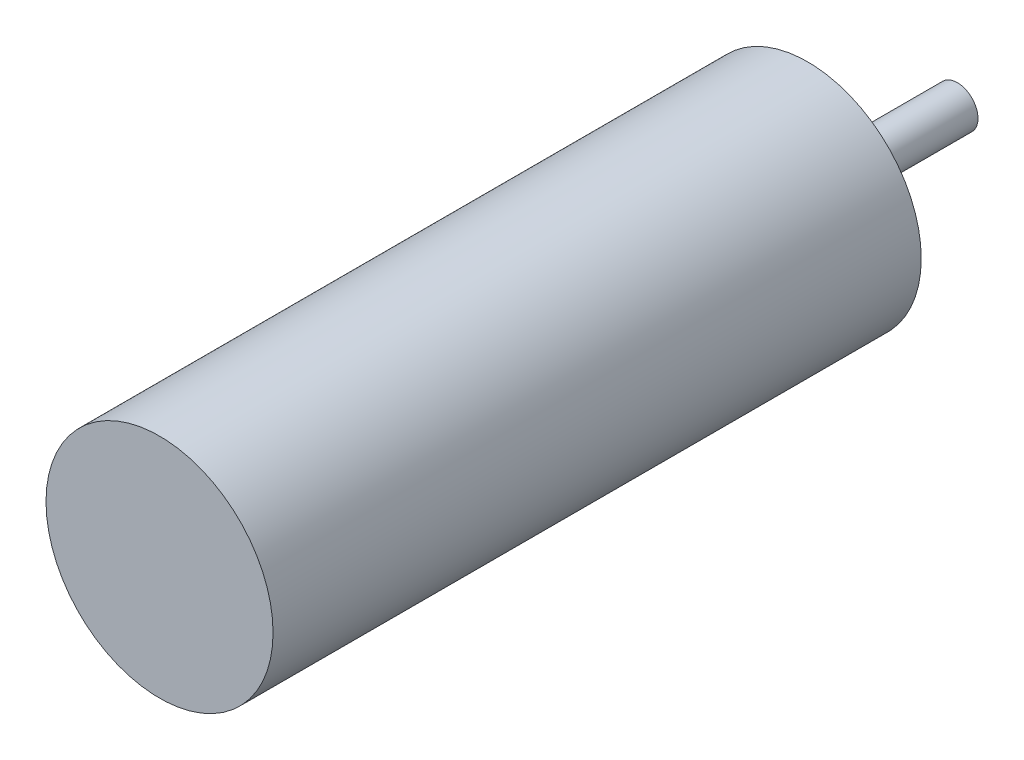
ISO-10303-21;
HEADER;
FILE_DESCRIPTION(('STEP AP214'),'2;1');
FILE_NAME('part.step','',(''),(''),'','','');
FILE_SCHEMA(('AUTOMOTIVE_DESIGN { 1 0 10303 214 1 1 1 1 }'));
ENDSEC;
DATA;
#1=APPLICATION_CONTEXT('core data for automotive mechanical design processes');
#2=APPLICATION_PROTOCOL_DEFINITION('international standard','automotive_design',2000,#1);
#3=PRODUCT_CONTEXT('',#1,'mechanical');
#4=PRODUCT('Part','Part','',(#3));
#5=PRODUCT_RELATED_PRODUCT_CATEGORY('part','',(#4));
#6=PRODUCT_DEFINITION_FORMATION('','',#4);
#7=PRODUCT_DEFINITION_CONTEXT('part definition',#1,'design');
#8=PRODUCT_DEFINITION('design','',#6,#7);
#9=PRODUCT_DEFINITION_SHAPE('','',#8);
#10=(LENGTH_UNIT() NAMED_UNIT(*) SI_UNIT(.MILLI.,.METRE.));
#11=(NAMED_UNIT(*) PLANE_ANGLE_UNIT() SI_UNIT($,.RADIAN.));
#12=(NAMED_UNIT(*) SI_UNIT($,.STERADIAN.) SOLID_ANGLE_UNIT());
#13=UNCERTAINTY_MEASURE_WITH_UNIT(LENGTH_MEASURE(1.E-05),#10,'distance_accuracy_value','');
#14=(GEOMETRIC_REPRESENTATION_CONTEXT(3) GLOBAL_UNCERTAINTY_ASSIGNED_CONTEXT((#13)) GLOBAL_UNIT_ASSIGNED_CONTEXT((#10,
#11,#12)) REPRESENTATION_CONTEXT('',''));
#15=CARTESIAN_POINT('',(0.,0.,0.));
#16=DIRECTION('',(0.,0.,1.));
#17=DIRECTION('',(1.,0.,0.));
#18=AXIS2_PLACEMENT_3D('',#15,#16,#17);
#19=CARTESIAN_POINT('',(0.,0.,0.));
#20=DIRECTION('',(0.,0.,1.));
#21=DIRECTION('',(1.,0.,0.));
#22=AXIS2_PLACEMENT_3D('',#19,#20,#21);
#23=PLANE('',#22);
#24=CARTESIAN_POINT('',(0.,0.,0.));
#25=DIRECTION('',(0.,0.,1.));
#26=DIRECTION('',(1.,0.,0.));
#27=AXIS2_PLACEMENT_3D('',#24,#25,#26);
#28=CIRCLE('',#27,11.);
#29=CARTESIAN_POINT('',(11.,0.,0.));
#30=VERTEX_POINT('',#29);
#31=EDGE_CURVE('E10',#30,#30,#28,.T.);
#32=ORIENTED_EDGE('',*,*,#31,.T.);
#33=EDGE_LOOP('',(#32));
#34=FACE_BOUND('',#33,.T.);
#35=ADVANCED_FACE('F37',(#34),#23,.T.);
#36=CARTESIAN_POINT('',(0.,0.,0.));
#37=DIRECTION('',(0.,0.,1.));
#38=DIRECTION('',(1.,0.,0.));
#39=AXIS2_PLACEMENT_3D('',#36,#37,#38);
#40=CYLINDRICAL_SURFACE('',#39,11.);
#41=CARTESIAN_POINT('',(0.,0.,-62.8));
#42=DIRECTION('',(0.,0.,1.));
#43=DIRECTION('',(1.,0.,0.));
#44=AXIS2_PLACEMENT_3D('',#41,#42,#43);
#45=CIRCLE('',#44,11.);
#46=CARTESIAN_POINT('',(11.,0.,-62.8));
#47=VERTEX_POINT('',#46);
#48=EDGE_CURVE('E43',#47,#47,#45,.T.);
#49=ORIENTED_EDGE('',*,*,#48,.T.);
#50=EDGE_LOOP('',(#49));
#51=FACE_BOUND('',#50,.T.);
#52=ORIENTED_EDGE('',*,*,#31,.F.);
#53=EDGE_LOOP('',(#52));
#54=FACE_BOUND('',#53,.T.);
#55=ADVANCED_FACE('F94',(#51,#54),#40,.T.);
#56=CARTESIAN_POINT('',(11.,0.,-62.8));
#57=DIRECTION('',(0.,0.,-1.));
#58=DIRECTION('',(-1.,0.,0.));
#59=AXIS2_PLACEMENT_3D('',#56,#57,#58);
#60=PLANE('',#59);
#61=CARTESIAN_POINT('',(0.,9.23760430703401,-62.8));
#62=DIRECTION('',(0.,0.,-1.));
#63=DIRECTION('',(-1.,0.,0.));
#64=AXIS2_PLACEMENT_3D('',#61,#62,#63);
#65=CIRCLE('',#64,1.);
#66=CARTESIAN_POINT('',(-1.,9.23760430703401,-62.8));
#67=VERTEX_POINT('',#66);
#68=EDGE_CURVE('E75',#67,#67,#65,.T.);
#69=ORIENTED_EDGE('',*,*,#68,.F.);
#70=EDGE_LOOP('',(#69));
#71=FACE_BOUND('',#70,.T.);
#72=CARTESIAN_POINT('',(-8.,-4.618802153517,-62.8));
#73=DIRECTION('',(0.,0.,-1.));
#74=DIRECTION('',(-1.,0.,0.));
#75=AXIS2_PLACEMENT_3D('',#72,#73,#74);
#76=CIRCLE('',#75,1.);
#77=CARTESIAN_POINT('',(-9.,-4.618802153517,-62.8));
#78=VERTEX_POINT('',#77);
#79=EDGE_CURVE('E72',#78,#78,#76,.T.);
#80=ORIENTED_EDGE('',*,*,#79,.F.);
#81=EDGE_LOOP('',(#80));
#82=FACE_BOUND('',#81,.T.);
#83=CARTESIAN_POINT('',(8.,-4.618802153517,-62.8));
#84=DIRECTION('',(0.,0.,-1.));
#85=DIRECTION('',(-1.,0.,0.));
#86=AXIS2_PLACEMENT_3D('',#83,#84,#85);
#87=CIRCLE('',#86,1.);
#88=CARTESIAN_POINT('',(7.,-4.618802153517,-62.8));
#89=VERTEX_POINT('',#88);
#90=EDGE_CURVE('E66',#89,#89,#87,.T.);
#91=ORIENTED_EDGE('',*,*,#90,.F.);
#92=EDGE_LOOP('',(#91));
#93=FACE_BOUND('',#92,.T.);
#94=CARTESIAN_POINT('',(0.,0.,-62.8));
#95=DIRECTION('',(0.,0.,1.));
#96=DIRECTION('',(1.,0.,0.));
#97=AXIS2_PLACEMENT_3D('',#94,#95,#96);
#98=CIRCLE('',#97,7.);
#99=CARTESIAN_POINT('',(7.,0.,-62.8));
#100=VERTEX_POINT('',#99);
#101=EDGE_CURVE('E47',#100,#100,#98,.T.);
#102=ORIENTED_EDGE('',*,*,#101,.T.);
#103=EDGE_LOOP('',(#102));
#104=FACE_BOUND('',#103,.T.);
#105=ORIENTED_EDGE('',*,*,#48,.F.);
#106=EDGE_LOOP('',(#105));
#107=FACE_BOUND('',#106,.T.);
#108=ADVANCED_FACE('F90',(#71,#82,#93,#104,#107),#60,.T.);
#109=CARTESIAN_POINT('',(0.,0.,0.));
#110=DIRECTION('',(0.,0.,1.));
#111=DIRECTION('',(1.,0.,0.));
#112=AXIS2_PLACEMENT_3D('',#109,#110,#111);
#113=CYLINDRICAL_SURFACE('',#112,7.);
#114=CARTESIAN_POINT('',(0.,0.,-65.3));
#115=DIRECTION('',(0.,0.,1.));
#116=DIRECTION('',(1.,0.,0.));
#117=AXIS2_PLACEMENT_3D('',#114,#115,#116);
#118=CIRCLE('',#117,7.);
#119=CARTESIAN_POINT('',(7.,0.,-65.3));
#120=VERTEX_POINT('',#119);
#121=EDGE_CURVE('E51',#120,#120,#118,.T.);
#122=ORIENTED_EDGE('',*,*,#121,.T.);
#123=EDGE_LOOP('',(#122));
#124=FACE_BOUND('',#123,.T.);
#125=ORIENTED_EDGE('',*,*,#101,.F.);
#126=EDGE_LOOP('',(#125));
#127=FACE_BOUND('',#126,.T.);
#128=ADVANCED_FACE('F93',(#124,#127),#113,.T.);
#129=CARTESIAN_POINT('',(7.,0.,-65.3));
#130=DIRECTION('',(0.,0.,-1.));
#131=DIRECTION('',(-1.,0.,0.));
#132=AXIS2_PLACEMENT_3D('',#129,#130,#131);
#133=PLANE('',#132);
#134=CARTESIAN_POINT('',(0.,0.,-65.3));
#135=DIRECTION('',(0.,0.,1.));
#136=DIRECTION('',(1.,0.,0.));
#137=AXIS2_PLACEMENT_3D('',#134,#135,#136);
#138=CIRCLE('',#137,2.);
#139=CARTESIAN_POINT('',(2.,0.,-65.3));
#140=VERTEX_POINT('',#139);
#141=EDGE_CURVE('E56',#140,#140,#138,.T.);
#142=ORIENTED_EDGE('',*,*,#141,.T.);
#143=EDGE_LOOP('',(#142));
#144=FACE_BOUND('',#143,.T.);
#145=ORIENTED_EDGE('',*,*,#121,.F.);
#146=EDGE_LOOP('',(#145));
#147=FACE_BOUND('',#146,.T.);
#148=ADVANCED_FACE('F104',(#144,#147),#133,.T.);
#149=CARTESIAN_POINT('',(0.,0.,0.));
#150=DIRECTION('',(0.,0.,1.));
#151=DIRECTION('',(1.,0.,0.));
#152=AXIS2_PLACEMENT_3D('',#149,#150,#151);
#153=CYLINDRICAL_SURFACE('',#152,2.);
#154=CARTESIAN_POINT('',(0.,0.,-77.3));
#155=DIRECTION('',(0.,0.,1.));
#156=DIRECTION('',(1.,0.,0.));
#157=AXIS2_PLACEMENT_3D('',#154,#155,#156);
#158=CIRCLE('',#157,2.);
#159=CARTESIAN_POINT('',(2.,0.,-77.3));
#160=VERTEX_POINT('',#159);
#161=EDGE_CURVE('E59',#160,#160,#158,.T.);
#162=ORIENTED_EDGE('',*,*,#161,.T.);
#163=EDGE_LOOP('',(#162));
#164=FACE_BOUND('',#163,.T.);
#165=ORIENTED_EDGE('',*,*,#141,.F.);
#166=EDGE_LOOP('',(#165));
#167=FACE_BOUND('',#166,.T.);
#168=ADVANCED_FACE('F111',(#164,#167),#153,.T.);
#169=CARTESIAN_POINT('',(2.,0.,-77.3));
#170=DIRECTION('',(0.,0.,-1.));
#171=DIRECTION('',(-1.,0.,0.));
#172=AXIS2_PLACEMENT_3D('',#169,#170,#171);
#173=PLANE('',#172);
#174=ORIENTED_EDGE('',*,*,#161,.F.);
#175=EDGE_LOOP('',(#174));
#176=FACE_BOUND('',#175,.T.);
#177=ADVANCED_FACE('F151',(#176),#173,.T.);
#178=CARTESIAN_POINT('',(8.,-4.618802153517,-59.8));
#179=DIRECTION('',(0.,0.,-1.));
#180=DIRECTION('',(-1.,0.,0.));
#181=AXIS2_PLACEMENT_3D('',#178,#179,#180);
#182=CYLINDRICAL_SURFACE('',#181,1.);
#183=CARTESIAN_POINT('',(8.,-4.618802153517,-59.8));
#184=DIRECTION('',(0.,0.,-1.));
#185=DIRECTION('',(-1.,0.,0.));
#186=AXIS2_PLACEMENT_3D('',#183,#184,#185);
#187=CIRCLE('',#186,1.);
#188=CARTESIAN_POINT('',(7.,-4.618802153517,-59.8));
#189=VERTEX_POINT('',#188);
#190=EDGE_CURVE('E63',#189,#189,#187,.T.);
#191=ORIENTED_EDGE('',*,*,#190,.F.);
#192=EDGE_LOOP('',(#191));
#193=FACE_BOUND('',#192,.T.);
#194=ORIENTED_EDGE('',*,*,#90,.T.);
#195=EDGE_LOOP('',(#194));
#196=FACE_BOUND('',#195,.T.);
#197=ADVANCED_FACE('F160',(#193,#196),#182,.F.);
#198=CARTESIAN_POINT('',(8.,-4.618802153517,-59.8));
#199=DIRECTION('',(0.,0.,-1.));
#200=DIRECTION('',(-1.,0.,0.));
#201=AXIS2_PLACEMENT_3D('',#198,#199,#200);
#202=PLANE('',#201);
#203=ORIENTED_EDGE('',*,*,#190,.T.);
#204=EDGE_LOOP('',(#203));
#205=FACE_BOUND('',#204,.T.);
#206=ADVANCED_FACE('F169',(#205),#202,.T.);
#207=CARTESIAN_POINT('',(-8.,-4.618802153517,-59.8));
#208=DIRECTION('',(0.,0.,-1.));
#209=DIRECTION('',(-1.,0.,0.));
#210=AXIS2_PLACEMENT_3D('',#207,#208,#209);
#211=CYLINDRICAL_SURFACE('',#210,1.);
#212=CARTESIAN_POINT('',(-8.,-4.618802153517,-59.8));
#213=DIRECTION('',(0.,0.,-1.));
#214=DIRECTION('',(-1.,0.,0.));
#215=AXIS2_PLACEMENT_3D('',#212,#213,#214);
#216=CIRCLE('',#215,1.);
#217=CARTESIAN_POINT('',(-9.,-4.618802153517,-59.8));
#218=VERTEX_POINT('',#217);
#219=EDGE_CURVE('E69',#218,#218,#216,.T.);
#220=ORIENTED_EDGE('',*,*,#219,.F.);
#221=EDGE_LOOP('',(#220));
#222=FACE_BOUND('',#221,.T.);
#223=ORIENTED_EDGE('',*,*,#79,.T.);
#224=EDGE_LOOP('',(#223));
#225=FACE_BOUND('',#224,.T.);
#226=ADVANCED_FACE('F179',(#222,#225),#211,.F.);
#227=CARTESIAN_POINT('',(-8.,-4.618802153517,-59.8));
#228=DIRECTION('',(0.,0.,-1.));
#229=DIRECTION('',(-1.,0.,0.));
#230=AXIS2_PLACEMENT_3D('',#227,#228,#229);
#231=PLANE('',#230);
#232=ORIENTED_EDGE('',*,*,#219,.T.);
#233=EDGE_LOOP('',(#232));
#234=FACE_BOUND('',#233,.T.);
#235=ADVANCED_FACE('F86',(#234),#231,.T.);
#236=CARTESIAN_POINT('',(0.,9.23760430703401,-59.8));
#237=DIRECTION('',(0.,0.,-1.));
#238=DIRECTION('',(-1.,0.,0.));
#239=AXIS2_PLACEMENT_3D('',#236,#237,#238);
#240=CYLINDRICAL_SURFACE('',#239,1.);
#241=CARTESIAN_POINT('',(0.,9.23760430703401,-59.8));
#242=DIRECTION('',(0.,0.,-1.));
#243=DIRECTION('',(-1.,0.,0.));
#244=AXIS2_PLACEMENT_3D('',#241,#242,#243);
#245=CIRCLE('',#244,1.);
#246=CARTESIAN_POINT('',(-1.,9.23760430703401,-59.8));
#247=VERTEX_POINT('',#246);
#248=EDGE_CURVE('E62',#247,#247,#245,.T.);
#249=ORIENTED_EDGE('',*,*,#248,.F.);
#250=EDGE_LOOP('',(#249));
#251=FACE_BOUND('',#250,.T.);
#252=ORIENTED_EDGE('',*,*,#68,.T.);
#253=EDGE_LOOP('',(#252));
#254=FACE_BOUND('',#253,.T.);
#255=ADVANCED_FACE('F83',(#251,#254),#240,.F.);
#256=CARTESIAN_POINT('',(0.,9.23760430703401,-59.8));
#257=DIRECTION('',(0.,0.,-1.));
#258=DIRECTION('',(-1.,0.,0.));
#259=AXIS2_PLACEMENT_3D('',#256,#257,#258);
#260=PLANE('',#259);
#261=ORIENTED_EDGE('',*,*,#248,.T.);
#262=EDGE_LOOP('',(#261));
#263=FACE_BOUND('',#262,.T.);
#264=ADVANCED_FACE('F81',(#263),#260,.T.);
#265=CLOSED_SHELL('',(#35,#55,#108,#128,#148,#168,#177,#197,#206,#226,#235,#255,#264));
#266=MANIFOLD_SOLID_BREP('B2',#265);
#267=ADVANCED_BREP_SHAPE_REPRESENTATION('',(#18,#266),#14);
#268=SHAPE_DEFINITION_REPRESENTATION(#9,#267);
ENDSEC;
END-ISO-10303-21;
